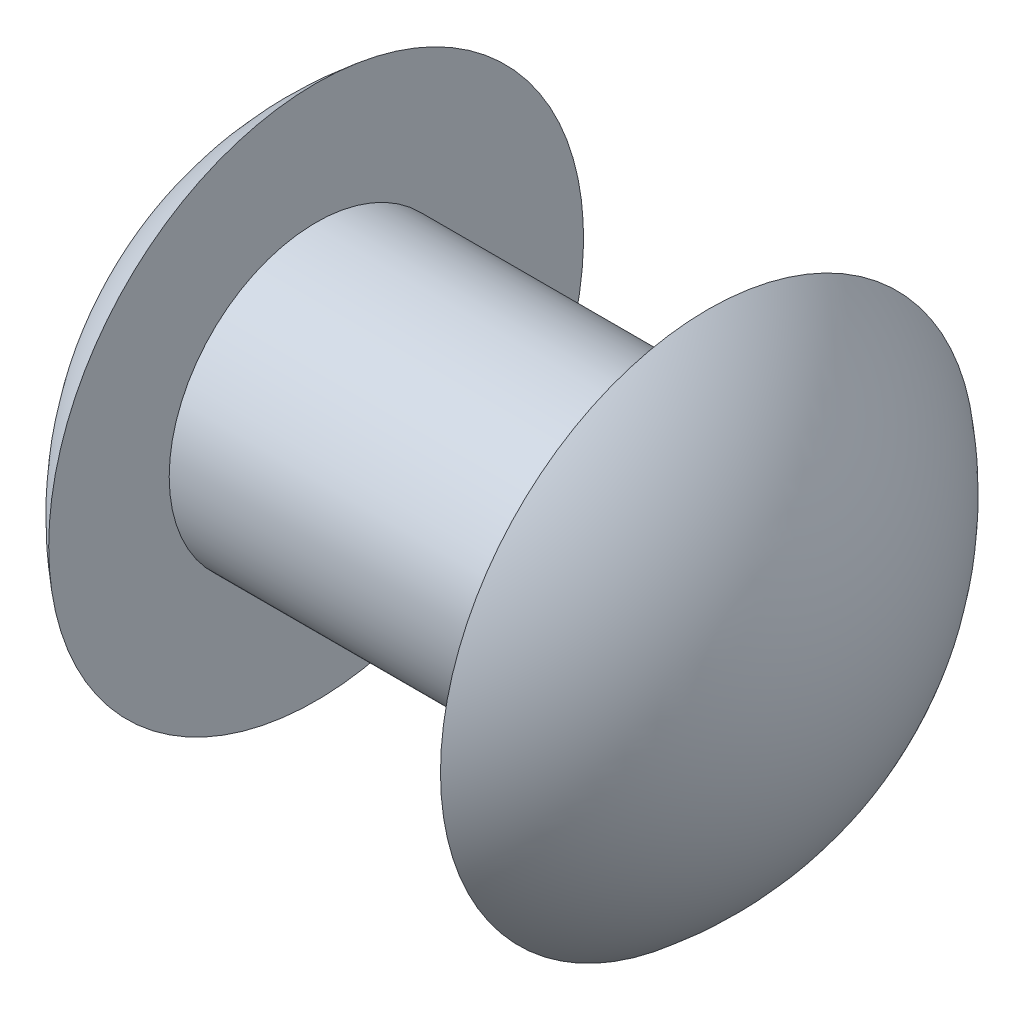
ISO-10303-21;
HEADER;
FILE_DESCRIPTION(('STEP AP214'),'2;1');
FILE_NAME('part.step','',(''),(''),'','','');
FILE_SCHEMA(('AUTOMOTIVE_DESIGN { 1 0 10303 214 1 1 1 1 }'));
ENDSEC;
DATA;
#1=APPLICATION_CONTEXT('core data for automotive mechanical design processes');
#2=APPLICATION_PROTOCOL_DEFINITION('international standard','automotive_design',2000,#1);
#3=PRODUCT_CONTEXT('',#1,'mechanical');
#4=PRODUCT('Part','Part','',(#3));
#5=PRODUCT_RELATED_PRODUCT_CATEGORY('part','',(#4));
#6=PRODUCT_DEFINITION_FORMATION('','',#4);
#7=PRODUCT_DEFINITION_CONTEXT('part definition',#1,'design');
#8=PRODUCT_DEFINITION('design','',#6,#7);
#9=PRODUCT_DEFINITION_SHAPE('','',#8);
#10=(LENGTH_UNIT() NAMED_UNIT(*) SI_UNIT(.MILLI.,.METRE.));
#11=(NAMED_UNIT(*) PLANE_ANGLE_UNIT() SI_UNIT($,.RADIAN.));
#12=(NAMED_UNIT(*) SI_UNIT($,.STERADIAN.) SOLID_ANGLE_UNIT());
#13=UNCERTAINTY_MEASURE_WITH_UNIT(LENGTH_MEASURE(1.E-05),#10,'distance_accuracy_value','');
#14=(GEOMETRIC_REPRESENTATION_CONTEXT(3) GLOBAL_UNCERTAINTY_ASSIGNED_CONTEXT((#13)) GLOBAL_UNIT_ASSIGNED_CONTEXT((#10,
#11,#12)) REPRESENTATION_CONTEXT('',''));
#15=CARTESIAN_POINT('',(0.,0.,0.));
#16=DIRECTION('',(0.,0.,1.));
#17=DIRECTION('',(1.,0.,0.));
#18=AXIS2_PLACEMENT_3D('',#15,#16,#17);
#19=CARTESIAN_POINT('',(-49.4235173824131,0.,0.));
#20=DIRECTION('',(-1.,0.,0.));
#21=DIRECTION('',(0.,0.,1.));
#22=AXIS2_PLACEMENT_3D('',#19,#20,#21);
#23=CYLINDRICAL_SURFACE('',#22,1.5);
#24=CARTESIAN_POINT('',(-0.017667154522609,0.,0.));
#25=DIRECTION('',(-1.,0.,0.));
#26=DIRECTION('',(0.,0.,1.));
#27=AXIS2_PLACEMENT_3D('',#24,#25,#26);
#28=CIRCLE('',#27,1.5);
#29=CARTESIAN_POINT('',(-0.017667154522609,0.,1.5));
#30=VERTEX_POINT('',#29);
#31=EDGE_CURVE('E41',#30,#30,#28,.T.);
#32=ORIENTED_EDGE('',*,*,#31,.F.);
#33=EDGE_LOOP('',(#32));
#34=FACE_BOUND('',#33,.T.);
#35=CARTESIAN_POINT('',(3.98233284547739,0.,0.));
#36=DIRECTION('',(-1.,0.,0.));
#37=DIRECTION('',(0.,0.,1.));
#38=AXIS2_PLACEMENT_3D('',#35,#36,#37);
#39=CIRCLE('',#38,1.5);
#40=CARTESIAN_POINT('',(3.98233284547739,0.,1.5));
#41=VERTEX_POINT('',#40);
#42=EDGE_CURVE('E10',#41,#41,#39,.T.);
#43=ORIENTED_EDGE('',*,*,#42,.T.);
#44=EDGE_LOOP('',(#43));
#45=FACE_BOUND('',#44,.T.);
#46=ADVANCED_FACE('F27',(#34,#45),#23,.T.);
#47=CARTESIAN_POINT('',(3.98233284547739,1.5,0.));
#48=DIRECTION('',(1.,0.,0.));
#49=DIRECTION('',(0.,0.,-1.));
#50=AXIS2_PLACEMENT_3D('',#47,#48,#49);
#51=PLANE('',#50);
#52=ORIENTED_EDGE('',*,*,#42,.F.);
#53=EDGE_LOOP('',(#52));
#54=FACE_BOUND('',#53,.T.);
#55=CARTESIAN_POINT('',(3.98233284547739,0.,0.));
#56=DIRECTION('',(-1.,0.,0.));
#57=DIRECTION('',(0.,0.,1.));
#58=AXIS2_PLACEMENT_3D('',#55,#56,#57);
#59=CIRCLE('',#58,2.730271716566);
#60=CARTESIAN_POINT('',(3.98233284547739,0.,2.730271716566));
#61=VERTEX_POINT('',#60);
#62=EDGE_CURVE('E33',#61,#61,#59,.T.);
#63=ORIENTED_EDGE('',*,*,#62,.T.);
#64=EDGE_LOOP('',(#63));
#65=FACE_BOUND('',#64,.T.);
#66=ADVANCED_FACE('F50',(#54,#65),#51,.F.);
#67=CARTESIAN_POINT('',(1.79244326978648,0.,0.));
#68=DIRECTION('',(-1.,0.,0.));
#69=DIRECTION('',(0.,1.,0.));
#70=AXIS2_PLACEMENT_3D('',#67,#68,#69);
#71=SPHERICAL_SURFACE('',#70,3.5);
#72=ORIENTED_EDGE('',*,*,#62,.F.);
#73=EDGE_LOOP('',(#72));
#74=FACE_BOUND('',#73,.T.);
#75=ADVANCED_FACE('F54',(#74),#71,.T.);
#76=CARTESIAN_POINT('',(2.17222242116831,0.,0.));
#77=DIRECTION('',(-1.,0.,0.));
#78=DIRECTION('',(0.,1.,0.));
#79=AXIS2_PLACEMENT_3D('',#76,#77,#78);
#80=SPHERICAL_SURFACE('',#79,3.5);
#81=CARTESIAN_POINT('',(-0.017667154522609,0.,0.));
#82=DIRECTION('',(-1.,0.,0.));
#83=DIRECTION('',(0.,0.,1.));
#84=AXIS2_PLACEMENT_3D('',#81,#82,#83);
#85=CIRCLE('',#84,2.730271716566);
#86=CARTESIAN_POINT('',(-0.017667154522609,0.,2.730271716566));
#87=VERTEX_POINT('',#86);
#88=EDGE_CURVE('E37',#87,#87,#85,.T.);
#89=ORIENTED_EDGE('',*,*,#88,.T.);
#90=EDGE_LOOP('',(#89));
#91=FACE_BOUND('',#90,.T.);
#92=ADVANCED_FACE('F59',(#91),#80,.T.);
#93=CARTESIAN_POINT('',(-0.0176671545226059,1.5,0.));
#94=DIRECTION('',(-1.,0.,0.));
#95=DIRECTION('',(0.,0.,1.));
#96=AXIS2_PLACEMENT_3D('',#93,#94,#95);
#97=PLANE('',#96);
#98=ORIENTED_EDGE('',*,*,#88,.F.);
#99=EDGE_LOOP('',(#98));
#100=FACE_BOUND('',#99,.T.);
#101=ORIENTED_EDGE('',*,*,#31,.T.);
#102=EDGE_LOOP('',(#101));
#103=FACE_BOUND('',#102,.T.);
#104=ADVANCED_FACE('F47',(#100,#103),#97,.F.);
#105=CLOSED_SHELL('',(#46,#66,#75,#92,#104));
#106=MANIFOLD_SOLID_BREP('B2',#105);
#107=ADVANCED_BREP_SHAPE_REPRESENTATION('',(#18,#106),#14);
#108=SHAPE_DEFINITION_REPRESENTATION(#9,#107);
ENDSEC;
END-ISO-10303-21;
